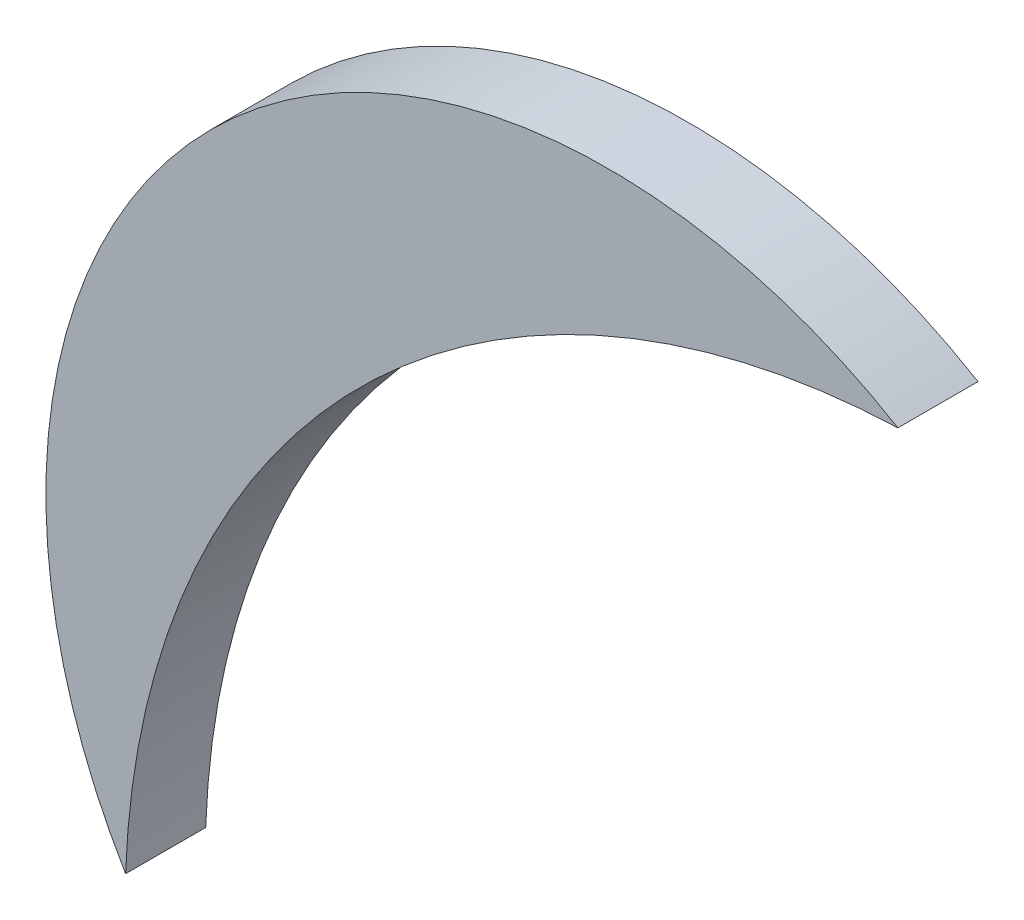
ISO-10303-21;
HEADER;
FILE_DESCRIPTION(('STEP AP214'),'2;1');
FILE_NAME('part.step','',(''),(''),'','','');
FILE_SCHEMA(('AUTOMOTIVE_DESIGN { 1 0 10303 214 1 1 1 1 }'));
ENDSEC;
DATA;
#1=APPLICATION_CONTEXT('core data for automotive mechanical design processes');
#2=APPLICATION_PROTOCOL_DEFINITION('international standard','automotive_design',2000,#1);
#3=PRODUCT_CONTEXT('',#1,'mechanical');
#4=PRODUCT('Part','Part','',(#3));
#5=PRODUCT_RELATED_PRODUCT_CATEGORY('part','',(#4));
#6=PRODUCT_DEFINITION_FORMATION('','',#4);
#7=PRODUCT_DEFINITION_CONTEXT('part definition',#1,'design');
#8=PRODUCT_DEFINITION('design','',#6,#7);
#9=PRODUCT_DEFINITION_SHAPE('','',#8);
#10=(LENGTH_UNIT() NAMED_UNIT(*) SI_UNIT(.MILLI.,.METRE.));
#11=(NAMED_UNIT(*) PLANE_ANGLE_UNIT() SI_UNIT($,.RADIAN.));
#12=(NAMED_UNIT(*) SI_UNIT($,.STERADIAN.) SOLID_ANGLE_UNIT());
#13=UNCERTAINTY_MEASURE_WITH_UNIT(LENGTH_MEASURE(1.E-05),#10,'distance_accuracy_value','');
#14=(GEOMETRIC_REPRESENTATION_CONTEXT(3) GLOBAL_UNCERTAINTY_ASSIGNED_CONTEXT((#13)) GLOBAL_UNIT_ASSIGNED_CONTEXT((#10,
#11,#12)) REPRESENTATION_CONTEXT('',''));
#15=CARTESIAN_POINT('',(0.,0.,0.));
#16=DIRECTION('',(0.,0.,1.));
#17=DIRECTION('',(1.,0.,0.));
#18=AXIS2_PLACEMENT_3D('',#15,#16,#17);
#19=CARTESIAN_POINT('',(89.03899896,105.8177716,0.));
#20=DIRECTION('',(0.,0.,-1.));
#21=DIRECTION('',(1.,0.,0.));
#22=AXIS2_PLACEMENT_3D('',#19,#20,#21);
#23=CYLINDRICAL_SURFACE('',#22,0.3556);
#24=DIRECTION('',(0.,0.,1.));
#25=VECTOR('',#24,1.);
#26=CARTESIAN_POINT('',(89.0264565448799,106.173150338564,0.));
#27=LINE('',#26,#25);
#28=CARTESIAN_POINT('',(89.0264565448799,106.173150338564,0.));
#29=VERTEX_POINT('',#28);
#30=CARTESIAN_POINT('',(89.0264565448799,106.173150338564,0.03556));
#31=VERTEX_POINT('',#30);
#32=EDGE_CURVE('E11',#29,#31,#27,.T.);
#33=ORIENTED_EDGE('',*,*,#32,.T.);
#34=CARTESIAN_POINT('',(89.03899896,105.8177716,0.03556));
#35=DIRECTION('',(0.,0.,1.));
#36=DIRECTION('',(1.,0.,0.));
#37=AXIS2_PLACEMENT_3D('',#34,#35,#36);
#38=CIRCLE('',#37,0.3556);
#39=CARTESIAN_POINT('',(88.6836202214365,105.83031401512,0.03556));
#40=VERTEX_POINT('',#39);
#41=EDGE_CURVE('E24',#31,#40,#38,.T.);
#42=ORIENTED_EDGE('',*,*,#41,.T.);
#43=DIRECTION('',(0.,0.,1.));
#44=VECTOR('',#43,1.);
#45=CARTESIAN_POINT('',(88.6836202214365,105.83031401512,0.));
#46=LINE('',#45,#44);
#47=CARTESIAN_POINT('',(88.6836202214365,105.83031401512,0.));
#48=VERTEX_POINT('',#47);
#49=EDGE_CURVE('E40',#48,#40,#46,.T.);
#50=ORIENTED_EDGE('',*,*,#49,.F.);
#51=CARTESIAN_POINT('',(89.03899896,105.8177716,0.));
#52=DIRECTION('',(0.,0.,1.));
#53=DIRECTION('',(1.,0.,0.));
#54=AXIS2_PLACEMENT_3D('',#51,#52,#53);
#55=CIRCLE('',#54,0.3556);
#56=EDGE_CURVE('E42',#29,#48,#55,.T.);
#57=ORIENTED_EDGE('',*,*,#56,.F.);
#58=EDGE_LOOP('',(#33,#42,#50,#57));
#59=FACE_BOUND('',#58,.T.);
#60=ADVANCED_FACE('F17',(#59),#23,.F.);
#61=CARTESIAN_POINT('',(88.89823216,105.9585384,0.));
#62=DIRECTION('',(0.,0.,-1.));
#63=DIRECTION('',(0.707106781186576,0.707106781186519,0.));
#64=AXIS2_PLACEMENT_3D('',#61,#62,#63);
#65=CYLINDRICAL_SURFACE('',#64,0.249999554103213);
#66=CARTESIAN_POINT('',(88.89823216,105.9585384,0.03556));
#67=DIRECTION('',(0.,0.,1.));
#68=DIRECTION('',(0.707106781186576,0.707106781186519,0.));
#69=AXIS2_PLACEMENT_3D('',#66,#67,#68);
#70=CIRCLE('',#69,0.249999554103213);
#71=EDGE_CURVE('E49',#31,#40,#70,.T.);
#72=ORIENTED_EDGE('',*,*,#71,.F.);
#73=ORIENTED_EDGE('',*,*,#32,.F.);
#74=CARTESIAN_POINT('',(88.89823216,105.9585384,0.));
#75=DIRECTION('',(0.,0.,1.));
#76=DIRECTION('',(0.707106781186576,0.707106781186519,0.));
#77=AXIS2_PLACEMENT_3D('',#74,#75,#76);
#78=CIRCLE('',#77,0.249999554103213);
#79=EDGE_CURVE('E48',#29,#48,#78,.T.);
#80=ORIENTED_EDGE('',*,*,#79,.T.);
#81=ORIENTED_EDGE('',*,*,#49,.T.);
#82=EDGE_LOOP('',(#72,#73,#80,#81));
#83=FACE_BOUND('',#82,.T.);
#84=ADVANCED_FACE('F51',(#83),#65,.T.);
#85=CARTESIAN_POINT('',(88.72145578,105.78176202,0.));
#86=DIRECTION('',(0.,0.,-1.));
#87=DIRECTION('',(-1.,0.,0.));
#88=AXIS2_PLACEMENT_3D('',#85,#86,#87);
#89=PLANE('',#88);
#90=ORIENTED_EDGE('',*,*,#56,.T.);
#91=ORIENTED_EDGE('',*,*,#79,.F.);
#92=EDGE_LOOP('',(#90,#91));
#93=FACE_BOUND('',#92,.T.);
#94=ADVANCED_FACE('F47',(#93),#89,.T.);
#95=CARTESIAN_POINT('',(88.72145578,105.78176202,0.03556));
#96=DIRECTION('',(0.,0.,-1.));
#97=DIRECTION('',(-1.,0.,0.));
#98=AXIS2_PLACEMENT_3D('',#95,#96,#97);
#99=PLANE('',#98);
#100=ORIENTED_EDGE('',*,*,#71,.T.);
#101=ORIENTED_EDGE('',*,*,#41,.F.);
#102=EDGE_LOOP('',(#100,#101));
#103=FACE_BOUND('',#102,.T.);
#104=ADVANCED_FACE('F55',(#103),#99,.F.);
#105=CLOSED_SHELL('',(#60,#84,#94,#104));
#106=MANIFOLD_SOLID_BREP('B1',#105);
#107=ADVANCED_BREP_SHAPE_REPRESENTATION('',(#18,#106),#14);
#108=SHAPE_DEFINITION_REPRESENTATION(#9,#107);
ENDSEC;
END-ISO-10303-21;
